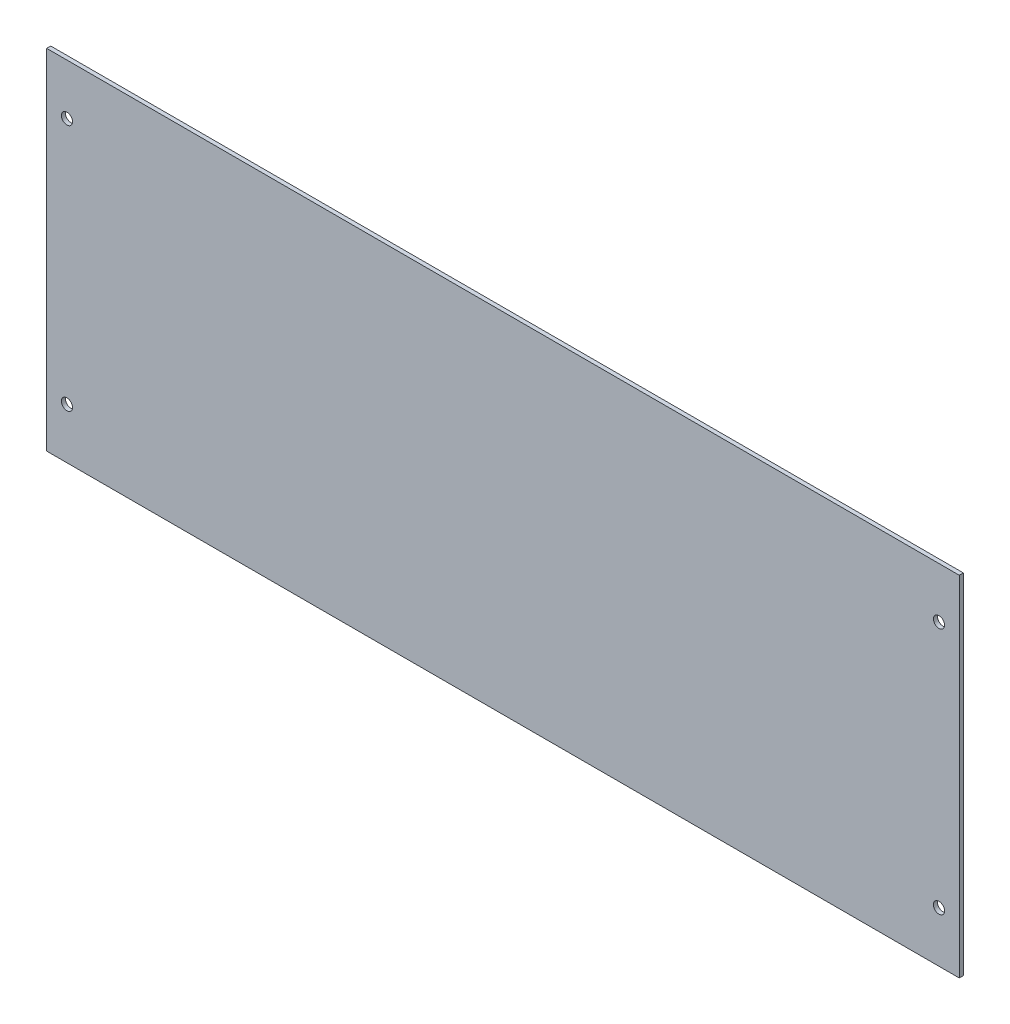
ISO-10303-21;
HEADER;
FILE_DESCRIPTION(('STEP AP214'),'2;1');
FILE_NAME('part.step','',(''),(''),'','','');
FILE_SCHEMA(('AUTOMOTIVE_DESIGN { 1 0 10303 214 1 1 1 1 }'));
ENDSEC;
DATA;
#1=APPLICATION_CONTEXT('core data for automotive mechanical design processes');
#2=APPLICATION_PROTOCOL_DEFINITION('international standard','automotive_design',2000,#1);
#3=PRODUCT_CONTEXT('',#1,'mechanical');
#4=PRODUCT('Part','Part','',(#3));
#5=PRODUCT_RELATED_PRODUCT_CATEGORY('part','',(#4));
#6=PRODUCT_DEFINITION_FORMATION('','',#4);
#7=PRODUCT_DEFINITION_CONTEXT('part definition',#1,'design');
#8=PRODUCT_DEFINITION('design','',#6,#7);
#9=PRODUCT_DEFINITION_SHAPE('','',#8);
#10=(LENGTH_UNIT() NAMED_UNIT(*) SI_UNIT(.MILLI.,.METRE.));
#11=(NAMED_UNIT(*) PLANE_ANGLE_UNIT() SI_UNIT($,.RADIAN.));
#12=(NAMED_UNIT(*) SI_UNIT($,.STERADIAN.) SOLID_ANGLE_UNIT());
#13=UNCERTAINTY_MEASURE_WITH_UNIT(LENGTH_MEASURE(1.E-05),#10,'distance_accuracy_value','');
#14=(GEOMETRIC_REPRESENTATION_CONTEXT(3) GLOBAL_UNCERTAINTY_ASSIGNED_CONTEXT((#13)) GLOBAL_UNIT_ASSIGNED_CONTEXT((#10,
#11,#12)) REPRESENTATION_CONTEXT('',''));
#15=CARTESIAN_POINT('',(0.,0.,0.));
#16=DIRECTION('',(0.,0.,1.));
#17=DIRECTION('',(1.,0.,0.));
#18=AXIS2_PLACEMENT_3D('',#15,#16,#17);
#19=CARTESIAN_POINT('',(225.,86.,2.));
#20=DIRECTION('',(-1.,0.,0.));
#21=DIRECTION('',(0.,0.,1.));
#22=AXIS2_PLACEMENT_3D('',#19,#20,#21);
#23=PLANE('',#22);
#24=DIRECTION('',(0.,1.,0.));
#25=VECTOR('',#24,1.);
#26=CARTESIAN_POINT('',(225.,86.,0.));
#27=LINE('',#26,#25);
#28=CARTESIAN_POINT('',(225.,-86.,0.));
#29=VERTEX_POINT('',#28);
#30=CARTESIAN_POINT('',(225.,86.,0.));
#31=VERTEX_POINT('',#30);
#32=EDGE_CURVE('E112',#29,#31,#27,.T.);
#33=ORIENTED_EDGE('',*,*,#32,.T.);
#34=DIRECTION('',(0.,0.,-1.));
#35=VECTOR('',#34,1.);
#36=CARTESIAN_POINT('',(225.,86.,2.));
#37=LINE('',#36,#35);
#38=CARTESIAN_POINT('',(225.,86.,2.));
#39=VERTEX_POINT('',#38);
#40=EDGE_CURVE('E11',#39,#31,#37,.T.);
#41=ORIENTED_EDGE('',*,*,#40,.F.);
#42=DIRECTION('',(0.,1.,0.));
#43=VECTOR('',#42,1.);
#44=CARTESIAN_POINT('',(225.,86.,2.));
#45=LINE('',#44,#43);
#46=CARTESIAN_POINT('',(225.,-86.,2.));
#47=VERTEX_POINT('',#46);
#48=EDGE_CURVE('E96',#47,#39,#45,.T.);
#49=ORIENTED_EDGE('',*,*,#48,.F.);
#50=DIRECTION('',(0.,0.,-1.));
#51=VECTOR('',#50,1.);
#52=CARTESIAN_POINT('',(225.,-86.,2.));
#53=LINE('',#52,#51);
#54=EDGE_CURVE('E108',#47,#29,#53,.T.);
#55=ORIENTED_EDGE('',*,*,#54,.T.);
#56=EDGE_LOOP('',(#33,#41,#49,#55));
#57=FACE_BOUND('',#56,.T.);
#58=ADVANCED_FACE('F44',(#57),#23,.F.);
#59=CARTESIAN_POINT('',(-225.,86.,2.));
#60=DIRECTION('',(0.,-1.,0.));
#61=DIRECTION('',(0.,0.,-1.));
#62=AXIS2_PLACEMENT_3D('',#59,#60,#61);
#63=PLANE('',#62);
#64=DIRECTION('',(-1.,0.,0.));
#65=VECTOR('',#64,1.);
#66=CARTESIAN_POINT('',(-225.,86.,0.));
#67=LINE('',#66,#65);
#68=CARTESIAN_POINT('',(-225.,86.,0.));
#69=VERTEX_POINT('',#68);
#70=EDGE_CURVE('E101',#31,#69,#67,.T.);
#71=ORIENTED_EDGE('',*,*,#70,.T.);
#72=DIRECTION('',(0.,0.,-1.));
#73=VECTOR('',#72,1.);
#74=CARTESIAN_POINT('',(-225.,86.,2.));
#75=LINE('',#74,#73);
#76=CARTESIAN_POINT('',(-225.,86.,2.));
#77=VERTEX_POINT('',#76);
#78=EDGE_CURVE('E53',#77,#69,#75,.T.);
#79=ORIENTED_EDGE('',*,*,#78,.F.);
#80=DIRECTION('',(-1.,0.,0.));
#81=VECTOR('',#80,1.);
#82=CARTESIAN_POINT('',(-225.,86.,2.));
#83=LINE('',#82,#81);
#84=EDGE_CURVE('E91',#39,#77,#83,.T.);
#85=ORIENTED_EDGE('',*,*,#84,.F.);
#86=ORIENTED_EDGE('',*,*,#40,.T.);
#87=EDGE_LOOP('',(#71,#79,#85,#86));
#88=FACE_BOUND('',#87,.T.);
#89=ADVANCED_FACE('F100',(#88),#63,.F.);
#90=CARTESIAN_POINT('',(-225.,86.,2.));
#91=DIRECTION('',(1.,0.,0.));
#92=DIRECTION('',(0.,0.,-1.));
#93=AXIS2_PLACEMENT_3D('',#90,#91,#92);
#94=PLANE('',#93);
#95=DIRECTION('',(0.,-1.,0.));
#96=VECTOR('',#95,1.);
#97=CARTESIAN_POINT('',(-225.,86.,0.));
#98=LINE('',#97,#96);
#99=CARTESIAN_POINT('',(-225.,-86.,0.));
#100=VERTEX_POINT('',#99);
#101=EDGE_CURVE('E78',#69,#100,#98,.T.);
#102=ORIENTED_EDGE('',*,*,#101,.T.);
#103=DIRECTION('',(0.,0.,-1.));
#104=VECTOR('',#103,1.);
#105=CARTESIAN_POINT('',(-225.,-86.,2.));
#106=LINE('',#105,#104);
#107=CARTESIAN_POINT('',(-225.,-86.,2.));
#108=VERTEX_POINT('',#107);
#109=EDGE_CURVE('E103',#108,#100,#106,.T.);
#110=ORIENTED_EDGE('',*,*,#109,.F.);
#111=DIRECTION('',(0.,-1.,0.));
#112=VECTOR('',#111,1.);
#113=CARTESIAN_POINT('',(-225.,86.,2.));
#114=LINE('',#113,#112);
#115=EDGE_CURVE('E94',#77,#108,#114,.T.);
#116=ORIENTED_EDGE('',*,*,#115,.F.);
#117=ORIENTED_EDGE('',*,*,#78,.T.);
#118=EDGE_LOOP('',(#102,#110,#116,#117));
#119=FACE_BOUND('',#118,.T.);
#120=ADVANCED_FACE('F104',(#119),#94,.F.);
#121=CARTESIAN_POINT('',(-225.,-86.,2.));
#122=DIRECTION('',(0.,1.,0.));
#123=DIRECTION('',(0.,0.,1.));
#124=AXIS2_PLACEMENT_3D('',#121,#122,#123);
#125=PLANE('',#124);
#126=DIRECTION('',(1.,0.,0.));
#127=VECTOR('',#126,1.);
#128=CARTESIAN_POINT('',(-225.,-86.,0.));
#129=LINE('',#128,#127);
#130=EDGE_CURVE('E84',#100,#29,#129,.T.);
#131=ORIENTED_EDGE('',*,*,#130,.T.);
#132=ORIENTED_EDGE('',*,*,#54,.F.);
#133=DIRECTION('',(1.,0.,0.));
#134=VECTOR('',#133,1.);
#135=CARTESIAN_POINT('',(-225.,-86.,2.));
#136=LINE('',#135,#134);
#137=EDGE_CURVE('E61',#108,#47,#136,.T.);
#138=ORIENTED_EDGE('',*,*,#137,.F.);
#139=ORIENTED_EDGE('',*,*,#109,.T.);
#140=EDGE_LOOP('',(#131,#132,#138,#139));
#141=FACE_BOUND('',#140,.T.);
#142=ADVANCED_FACE('F126',(#141),#125,.F.);
#143=CARTESIAN_POINT('',(0.,0.,2.));
#144=DIRECTION('',(0.,0.,1.));
#145=DIRECTION('',(1.,0.,0.));
#146=AXIS2_PLACEMENT_3D('',#143,#144,#145);
#147=PLANE('',#146);
#148=CARTESIAN_POINT('',(-214.999999999999,-61.,2.));
#149=DIRECTION('',(0.,0.,1.));
#150=DIRECTION('',(1.,0.,0.));
#151=AXIS2_PLACEMENT_3D('',#148,#149,#150);
#152=CIRCLE('',#151,2.75000000000001);
#153=CARTESIAN_POINT('',(-212.249999999999,-61.,2.));
#154=VERTEX_POINT('',#153);
#155=EDGE_CURVE('E145',#154,#154,#152,.T.);
#156=ORIENTED_EDGE('',*,*,#155,.F.);
#157=EDGE_LOOP('',(#156));
#158=FACE_BOUND('',#157,.T.);
#159=CARTESIAN_POINT('',(215.000000000001,-61.,2.));
#160=DIRECTION('',(0.,0.,1.));
#161=DIRECTION('',(1.,0.,0.));
#162=AXIS2_PLACEMENT_3D('',#159,#160,#161);
#163=CIRCLE('',#162,2.75000000000001);
#164=CARTESIAN_POINT('',(217.750000000001,-61.,2.));
#165=VERTEX_POINT('',#164);
#166=EDGE_CURVE('E153',#165,#165,#163,.T.);
#167=ORIENTED_EDGE('',*,*,#166,.F.);
#168=EDGE_LOOP('',(#167));
#169=FACE_BOUND('',#168,.T.);
#170=CARTESIAN_POINT('',(215.,61.,2.));
#171=DIRECTION('',(0.,0.,1.));
#172=DIRECTION('',(1.,0.,0.));
#173=AXIS2_PLACEMENT_3D('',#170,#171,#172);
#174=CIRCLE('',#173,2.75000000000001);
#175=CARTESIAN_POINT('',(217.75,61.,2.));
#176=VERTEX_POINT('',#175);
#177=EDGE_CURVE('E137',#176,#176,#174,.T.);
#178=ORIENTED_EDGE('',*,*,#177,.F.);
#179=EDGE_LOOP('',(#178));
#180=FACE_BOUND('',#179,.T.);
#181=CARTESIAN_POINT('',(-215.,61.,2.));
#182=DIRECTION('',(0.,0.,1.));
#183=DIRECTION('',(1.,0.,0.));
#184=AXIS2_PLACEMENT_3D('',#181,#182,#183);
#185=CIRCLE('',#184,2.75000000000001);
#186=CARTESIAN_POINT('',(-212.25,61.,2.));
#187=VERTEX_POINT('',#186);
#188=EDGE_CURVE('E133',#187,#187,#185,.T.);
#189=ORIENTED_EDGE('',*,*,#188,.F.);
#190=EDGE_LOOP('',(#189));
#191=FACE_BOUND('',#190,.T.);
#192=ORIENTED_EDGE('',*,*,#48,.T.);
#193=ORIENTED_EDGE('',*,*,#84,.T.);
#194=ORIENTED_EDGE('',*,*,#115,.T.);
#195=ORIENTED_EDGE('',*,*,#137,.T.);
#196=EDGE_LOOP('',(#192,#193,#194,#195));
#197=FACE_BOUND('',#196,.T.);
#198=ADVANCED_FACE('F92',(#158,#169,#180,#191,#197),#147,.T.);
#199=CARTESIAN_POINT('',(0.,0.,0.));
#200=DIRECTION('',(0.,0.,1.));
#201=DIRECTION('',(1.,0.,0.));
#202=AXIS2_PLACEMENT_3D('',#199,#200,#201);
#203=PLANE('',#202);
#204=CARTESIAN_POINT('',(-214.999999999999,-61.,0.));
#205=DIRECTION('',(0.,0.,1.));
#206=DIRECTION('',(1.,0.,0.));
#207=AXIS2_PLACEMENT_3D('',#204,#205,#206);
#208=CIRCLE('',#207,2.75000000000001);
#209=CARTESIAN_POINT('',(-212.249999999999,-61.,0.));
#210=VERTEX_POINT('',#209);
#211=EDGE_CURVE('E141',#210,#210,#208,.T.);
#212=ORIENTED_EDGE('',*,*,#211,.T.);
#213=EDGE_LOOP('',(#212));
#214=FACE_BOUND('',#213,.T.);
#215=CARTESIAN_POINT('',(215.000000000001,-61.,0.));
#216=DIRECTION('',(0.,0.,1.));
#217=DIRECTION('',(1.,0.,0.));
#218=AXIS2_PLACEMENT_3D('',#215,#216,#217);
#219=CIRCLE('',#218,2.75000000000001);
#220=CARTESIAN_POINT('',(217.750000000001,-61.,0.));
#221=VERTEX_POINT('',#220);
#222=EDGE_CURVE('E149',#221,#221,#219,.T.);
#223=ORIENTED_EDGE('',*,*,#222,.T.);
#224=EDGE_LOOP('',(#223));
#225=FACE_BOUND('',#224,.T.);
#226=CARTESIAN_POINT('',(215.,61.,0.));
#227=DIRECTION('',(0.,0.,1.));
#228=DIRECTION('',(1.,0.,0.));
#229=AXIS2_PLACEMENT_3D('',#226,#227,#228);
#230=CIRCLE('',#229,2.75000000000001);
#231=CARTESIAN_POINT('',(217.75,61.,0.));
#232=VERTEX_POINT('',#231);
#233=EDGE_CURVE('E157',#232,#232,#230,.T.);
#234=ORIENTED_EDGE('',*,*,#233,.T.);
#235=EDGE_LOOP('',(#234));
#236=FACE_BOUND('',#235,.T.);
#237=CARTESIAN_POINT('',(-215.,61.,0.));
#238=DIRECTION('',(0.,0.,1.));
#239=DIRECTION('',(1.,0.,0.));
#240=AXIS2_PLACEMENT_3D('',#237,#238,#239);
#241=CIRCLE('',#240,2.75000000000001);
#242=CARTESIAN_POINT('',(-212.25,61.,0.));
#243=VERTEX_POINT('',#242);
#244=EDGE_CURVE('E116',#243,#243,#241,.T.);
#245=ORIENTED_EDGE('',*,*,#244,.T.);
#246=EDGE_LOOP('',(#245));
#247=FACE_BOUND('',#246,.T.);
#248=ORIENTED_EDGE('',*,*,#32,.F.);
#249=ORIENTED_EDGE('',*,*,#130,.F.);
#250=ORIENTED_EDGE('',*,*,#101,.F.);
#251=ORIENTED_EDGE('',*,*,#70,.F.);
#252=EDGE_LOOP('',(#248,#249,#250,#251));
#253=FACE_BOUND('',#252,.T.);
#254=ADVANCED_FACE('F129',(#214,#225,#236,#247,#253),#203,.F.);
#255=CARTESIAN_POINT('',(-215.,61.,0.));
#256=DIRECTION('',(0.,0.,1.));
#257=DIRECTION('',(1.,0.,0.));
#258=AXIS2_PLACEMENT_3D('',#255,#256,#257);
#259=CYLINDRICAL_SURFACE('',#258,2.75000000000001);
#260=ORIENTED_EDGE('',*,*,#244,.F.);
#261=EDGE_LOOP('',(#260));
#262=FACE_BOUND('',#261,.T.);
#263=ORIENTED_EDGE('',*,*,#188,.T.);
#264=EDGE_LOOP('',(#263));
#265=FACE_BOUND('',#264,.T.);
#266=ADVANCED_FACE('F173',(#262,#265),#259,.F.);
#267=CARTESIAN_POINT('',(215.,61.,0.));
#268=DIRECTION('',(0.,0.,1.));
#269=DIRECTION('',(1.,0.,0.));
#270=AXIS2_PLACEMENT_3D('',#267,#268,#269);
#271=CYLINDRICAL_SURFACE('',#270,2.75000000000001);
#272=ORIENTED_EDGE('',*,*,#233,.F.);
#273=EDGE_LOOP('',(#272));
#274=FACE_BOUND('',#273,.T.);
#275=ORIENTED_EDGE('',*,*,#177,.T.);
#276=EDGE_LOOP('',(#275));
#277=FACE_BOUND('',#276,.T.);
#278=ADVANCED_FACE('F165',(#274,#277),#271,.F.);
#279=CARTESIAN_POINT('',(215.000000000001,-61.,0.));
#280=DIRECTION('',(0.,0.,1.));
#281=DIRECTION('',(1.,0.,0.));
#282=AXIS2_PLACEMENT_3D('',#279,#280,#281);
#283=CYLINDRICAL_SURFACE('',#282,2.75000000000001);
#284=ORIENTED_EDGE('',*,*,#222,.F.);
#285=EDGE_LOOP('',(#284));
#286=FACE_BOUND('',#285,.T.);
#287=ORIENTED_EDGE('',*,*,#166,.T.);
#288=EDGE_LOOP('',(#287));
#289=FACE_BOUND('',#288,.T.);
#290=ADVANCED_FACE('F181',(#286,#289),#283,.F.);
#291=CARTESIAN_POINT('',(-214.999999999999,-61.,0.));
#292=DIRECTION('',(0.,0.,1.));
#293=DIRECTION('',(1.,0.,0.));
#294=AXIS2_PLACEMENT_3D('',#291,#292,#293);
#295=CYLINDRICAL_SURFACE('',#294,2.75000000000001);
#296=ORIENTED_EDGE('',*,*,#211,.F.);
#297=EDGE_LOOP('',(#296));
#298=FACE_BOUND('',#297,.T.);
#299=ORIENTED_EDGE('',*,*,#155,.T.);
#300=EDGE_LOOP('',(#299));
#301=FACE_BOUND('',#300,.T.);
#302=ADVANCED_FACE('F232',(#298,#301),#295,.F.);
#303=CLOSED_SHELL('',(#58,#89,#120,#142,#198,#254,#266,#278,#290,#302));
#304=MANIFOLD_SOLID_BREP('B2',#303);
#305=ADVANCED_BREP_SHAPE_REPRESENTATION('',(#18,#304),#14);
#306=SHAPE_DEFINITION_REPRESENTATION(#9,#305);
ENDSEC;
END-ISO-10303-21;
